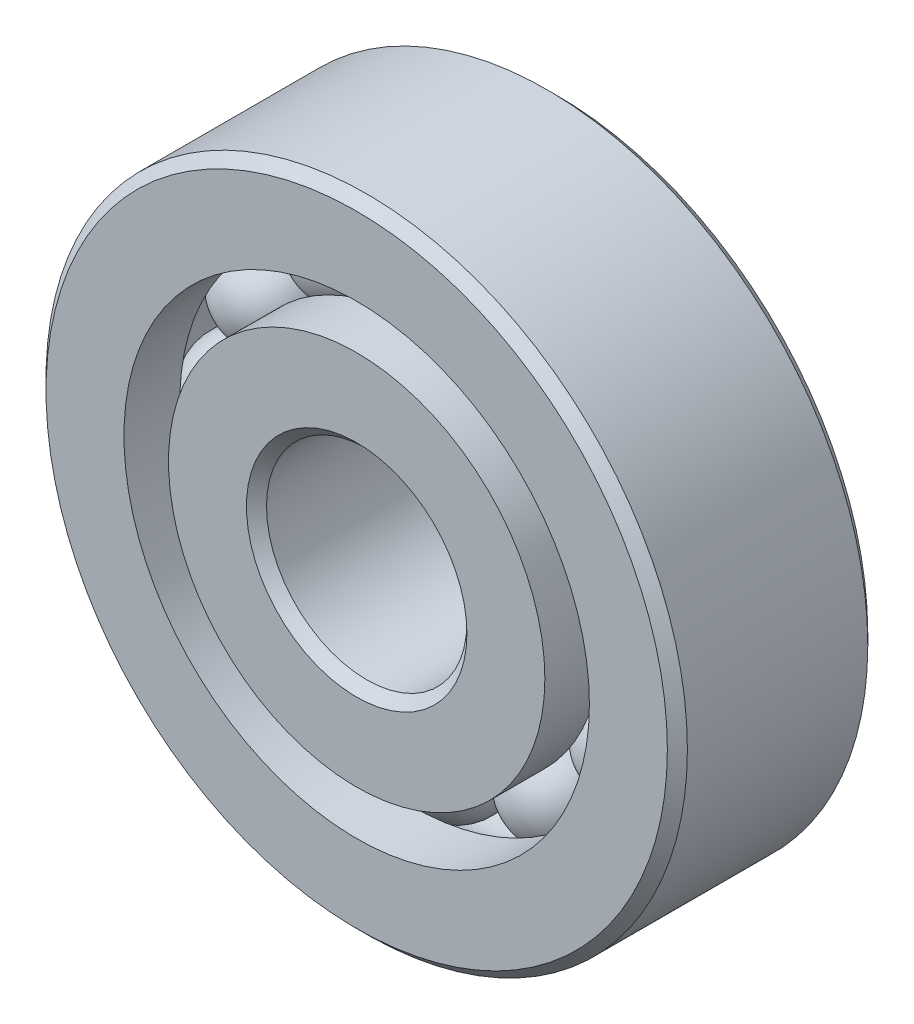
ISO-10303-21;
HEADER;
FILE_DESCRIPTION(('STEP AP214'),'2;1');
FILE_NAME('part.step','',(''),(''),'','','');
FILE_SCHEMA(('AUTOMOTIVE_DESIGN { 1 0 10303 214 1 1 1 1 }'));
ENDSEC;
DATA;
#1=APPLICATION_CONTEXT('core data for automotive mechanical design processes');
#2=APPLICATION_PROTOCOL_DEFINITION('international standard','automotive_design',2000,#1);
#3=PRODUCT_CONTEXT('',#1,'mechanical');
#4=PRODUCT('Part','Part','',(#3));
#5=PRODUCT_RELATED_PRODUCT_CATEGORY('part','',(#4));
#6=PRODUCT_DEFINITION_FORMATION('','',#4);
#7=PRODUCT_DEFINITION_CONTEXT('part definition',#1,'design');
#8=PRODUCT_DEFINITION('design','',#6,#7);
#9=PRODUCT_DEFINITION_SHAPE('','',#8);
#10=(LENGTH_UNIT() NAMED_UNIT(*) SI_UNIT(.MILLI.,.METRE.));
#11=(NAMED_UNIT(*) PLANE_ANGLE_UNIT() SI_UNIT($,.RADIAN.));
#12=(NAMED_UNIT(*) SI_UNIT($,.STERADIAN.) SOLID_ANGLE_UNIT());
#13=UNCERTAINTY_MEASURE_WITH_UNIT(LENGTH_MEASURE(1.E-05),#10,'distance_accuracy_value','');
#14=(GEOMETRIC_REPRESENTATION_CONTEXT(3) GLOBAL_UNCERTAINTY_ASSIGNED_CONTEXT((#13)) GLOBAL_UNIT_ASSIGNED_CONTEXT((#10,
#11,#12)) REPRESENTATION_CONTEXT('',''));
#15=CARTESIAN_POINT('',(0.,0.,0.));
#16=DIRECTION('',(0.,0.,1.));
#17=DIRECTION('',(1.,0.,0.));
#18=AXIS2_PLACEMENT_3D('',#15,#16,#17);
#19=CARTESIAN_POINT('',(-2.62499999999994,4.54663336986834,0.));
#20=DIRECTION('',(0.,0.,1.));
#21=DIRECTION('',(-0.499999999999989,0.866025403784445,0.));
#22=AXIS2_PLACEMENT_3D('',#19,#20,#21);
#23=SPHERICAL_SURFACE('',#22,1.24225998749988);
#24=CARTESIAN_POINT('',(-2.62499999999994,4.54663336986834,1.24225998749988));
#25=VERTEX_POINT('',#24);
#26=VERTEX_LOOP('',#25);
#27=FACE_BOUND('',#26,.T.);
#28=ADVANCED_FACE('F39',(#27),#23,.T.);
#29=CLOSED_SHELL('',(#28));
#30=MANIFOLD_SOLID_BREP('B2',#29);
#31=CARTESIAN_POINT('',(-4.54663336986827,2.62500000000005,0.));
#32=DIRECTION('',(0.,0.,1.));
#33=DIRECTION('',(-0.866025403784433,0.50000000000001,0.));
#34=AXIS2_PLACEMENT_3D('',#31,#32,#33);
#35=SPHERICAL_SURFACE('',#34,1.24225998749988);
#36=CARTESIAN_POINT('',(-4.54663336986827,2.62500000000005,1.24225998749988));
#37=VERTEX_POINT('',#36);
#38=VERTEX_LOOP('',#37);
#39=FACE_BOUND('',#38,.T.);
#40=ADVANCED_FACE('F70',(#39),#35,.T.);
#41=CLOSED_SHELL('',(#40));
#42=MANIFOLD_SOLID_BREP('B6',#41);
#43=CARTESIAN_POINT('',(-5.25,0.,0.));
#44=DIRECTION('',(0.,0.,1.));
#45=DIRECTION('',(-1.,0.,0.));
#46=AXIS2_PLACEMENT_3D('',#43,#44,#45);
#47=SPHERICAL_SURFACE('',#46,1.24225998749988);
#48=CARTESIAN_POINT('',(-5.25,0.,1.24225998749988));
#49=VERTEX_POINT('',#48);
#50=VERTEX_LOOP('',#49);
#51=FACE_BOUND('',#50,.T.);
#52=ADVANCED_FACE('F101',(#51),#47,.T.);
#53=CLOSED_SHELL('',(#52));
#54=MANIFOLD_SOLID_BREP('B35',#53);
#55=CARTESIAN_POINT('',(-4.54663336986833,-2.62499999999996,0.));
#56=DIRECTION('',(0.,0.,1.));
#57=DIRECTION('',(-0.866025403784443,-0.499999999999992,0.));
#58=AXIS2_PLACEMENT_3D('',#55,#56,#57);
#59=SPHERICAL_SURFACE('',#58,1.24225998749988);
#60=CARTESIAN_POINT('',(-4.54663336986833,-2.62499999999996,1.24225998749988));
#61=VERTEX_POINT('',#60);
#62=VERTEX_LOOP('',#61);
#63=FACE_BOUND('',#62,.T.);
#64=ADVANCED_FACE('F132',(#63),#59,.T.);
#65=CLOSED_SHELL('',(#64));
#66=MANIFOLD_SOLID_BREP('B66',#65);
#67=CARTESIAN_POINT('',(-2.62500000000004,-4.54663336986828,0.));
#68=DIRECTION('',(0.,0.,1.));
#69=DIRECTION('',(-0.500000000000007,-0.866025403784435,0.));
#70=AXIS2_PLACEMENT_3D('',#67,#68,#69);
#71=SPHERICAL_SURFACE('',#70,1.24225998749988);
#72=CARTESIAN_POINT('',(-2.62500000000004,-4.54663336986828,1.24225998749988));
#73=VERTEX_POINT('',#72);
#74=VERTEX_LOOP('',#73);
#75=FACE_BOUND('',#74,.T.);
#76=ADVANCED_FACE('F163',(#75),#71,.T.);
#77=CLOSED_SHELL('',(#76));
#78=MANIFOLD_SOLID_BREP('B97',#77);
#79=CARTESIAN_POINT('',(0.,-5.25,0.));
#80=DIRECTION('',(0.,0.,1.));
#81=DIRECTION('',(0.,-1.,0.));
#82=AXIS2_PLACEMENT_3D('',#79,#80,#81);
#83=SPHERICAL_SURFACE('',#82,1.24225998749988);
#84=CARTESIAN_POINT('',(0.,-5.25,1.24225998749988));
#85=VERTEX_POINT('',#84);
#86=VERTEX_LOOP('',#85);
#87=FACE_BOUND('',#86,.T.);
#88=ADVANCED_FACE('F194',(#87),#83,.T.);
#89=CLOSED_SHELL('',(#88));
#90=MANIFOLD_SOLID_BREP('B128',#89);
#91=CARTESIAN_POINT('',(2.62499999999997,-4.54663336986832,0.));
#92=DIRECTION('',(0.,0.,1.));
#93=DIRECTION('',(0.499999999999995,-0.866025403784442,0.));
#94=AXIS2_PLACEMENT_3D('',#91,#92,#93);
#95=SPHERICAL_SURFACE('',#94,1.24225998749988);
#96=CARTESIAN_POINT('',(2.62499999999997,-4.54663336986832,1.24225998749988));
#97=VERTEX_POINT('',#96);
#98=VERTEX_LOOP('',#97);
#99=FACE_BOUND('',#98,.T.);
#100=ADVANCED_FACE('F225',(#99),#95,.T.);
#101=CLOSED_SHELL('',(#100));
#102=MANIFOLD_SOLID_BREP('B159',#101);
#103=CARTESIAN_POINT('',(4.54663336986829,-2.62500000000002,0.));
#104=DIRECTION('',(0.,0.,1.));
#105=DIRECTION('',(0.866025403784436,-0.500000000000004,0.));
#106=AXIS2_PLACEMENT_3D('',#103,#104,#105);
#107=SPHERICAL_SURFACE('',#106,1.24225998749988);
#108=CARTESIAN_POINT('',(4.54663336986829,-2.62500000000002,1.24225998749988));
#109=VERTEX_POINT('',#108);
#110=VERTEX_LOOP('',#109);
#111=FACE_BOUND('',#110,.T.);
#112=ADVANCED_FACE('F258',(#111),#107,.T.);
#113=CLOSED_SHELL('',(#112));
#114=MANIFOLD_SOLID_BREP('B190',#113);
#115=CARTESIAN_POINT('',(5.25,0.,0.));
#116=DIRECTION('',(0.,0.,1.));
#117=DIRECTION('',(1.,0.,0.));
#118=AXIS2_PLACEMENT_3D('',#115,#116,#117);
#119=SPHERICAL_SURFACE('',#118,1.24225998749988);
#120=CARTESIAN_POINT('',(5.25,0.,1.24225998749988));
#121=VERTEX_POINT('',#120);
#122=VERTEX_LOOP('',#121);
#123=FACE_BOUND('',#122,.T.);
#124=ADVANCED_FACE('F291',(#123),#119,.T.);
#125=CLOSED_SHELL('',(#124));
#126=MANIFOLD_SOLID_BREP('B221',#125);
#127=CARTESIAN_POINT('',(4.54663336986831,2.62499999999999,0.));
#128=DIRECTION('',(0.,0.,1.));
#129=DIRECTION('',(0.86602540378444,0.499999999999998,0.));
#130=AXIS2_PLACEMENT_3D('',#127,#128,#129);
#131=SPHERICAL_SURFACE('',#130,1.24225998749988);
#132=CARTESIAN_POINT('',(4.54663336986831,2.62499999999999,1.24225998749988));
#133=VERTEX_POINT('',#132);
#134=VERTEX_LOOP('',#133);
#135=FACE_BOUND('',#134,.T.);
#136=ADVANCED_FACE('F324',(#135),#131,.T.);
#137=CLOSED_SHELL('',(#136));
#138=MANIFOLD_SOLID_BREP('B254',#137);
#139=CARTESIAN_POINT('',(2.62500000000001,4.5466333698683,0.));
#140=DIRECTION('',(0.,0.,1.));
#141=DIRECTION('',(0.500000000000001,0.866025403784438,0.));
#142=AXIS2_PLACEMENT_3D('',#139,#140,#141);
#143=SPHERICAL_SURFACE('',#142,1.24225998749988);
#144=CARTESIAN_POINT('',(2.62500000000001,4.5466333698683,1.24225998749988));
#145=VERTEX_POINT('',#144);
#146=VERTEX_LOOP('',#145);
#147=FACE_BOUND('',#146,.T.);
#148=ADVANCED_FACE('F355',(#147),#143,.T.);
#149=CLOSED_SHELL('',(#148));
#150=MANIFOLD_SOLID_BREP('B287',#149);
#151=CARTESIAN_POINT('',(0.,5.25,0.));
#152=DIRECTION('',(0.,0.,1.));
#153=DIRECTION('',(0.,1.,0.));
#154=AXIS2_PLACEMENT_3D('',#151,#152,#153);
#155=SPHERICAL_SURFACE('',#154,1.24225998749988);
#156=CARTESIAN_POINT('',(0.,5.25,1.24225998749988));
#157=VERTEX_POINT('',#156);
#158=VERTEX_LOOP('',#157);
#159=FACE_BOUND('',#158,.T.);
#160=ADVANCED_FACE('F388',(#159),#155,.T.);
#161=CLOSED_SHELL('',(#160));
#162=MANIFOLD_SOLID_BREP('B320',#161);
#163=CARTESIAN_POINT('',(0.,0.,2.25));
#164=DIRECTION('',(0.,0.,-1.));
#165=DIRECTION('',(-1.,0.,0.));
#166=AXIS2_PLACEMENT_3D('',#163,#164,#165);
#167=CONICAL_SURFACE('',#166,8.,0.785398163397447);
#168=CARTESIAN_POINT('',(0.,0.,2.5));
#169=DIRECTION('',(0.,0.,1.));
#170=DIRECTION('',(1.,0.,0.));
#171=AXIS2_PLACEMENT_3D('',#168,#169,#170);
#172=CIRCLE('',#171,7.75);
#173=CARTESIAN_POINT('',(7.75,0.,2.5));
#174=VERTEX_POINT('',#173);
#175=EDGE_CURVE('E435',#174,#174,#172,.T.);
#176=ORIENTED_EDGE('',*,*,#175,.F.);
#177=EDGE_LOOP('',(#176));
#178=FACE_BOUND('',#177,.T.);
#179=CARTESIAN_POINT('',(0.,0.,2.25));
#180=DIRECTION('',(0.,0.,1.));
#181=DIRECTION('',(1.,0.,0.));
#182=AXIS2_PLACEMENT_3D('',#179,#180,#181);
#183=CIRCLE('',#182,8.);
#184=CARTESIAN_POINT('',(8.,0.,2.25));
#185=VERTEX_POINT('',#184);
#186=EDGE_CURVE('E387',#185,#185,#183,.T.);
#187=ORIENTED_EDGE('',*,*,#186,.T.);
#188=EDGE_LOOP('',(#187));
#189=FACE_BOUND('',#188,.T.);
#190=ADVANCED_FACE('F407',(#178,#189),#167,.T.);
#191=CARTESIAN_POINT('',(0.,0.,2.5));
#192=DIRECTION('',(0.,0.,1.));
#193=DIRECTION('',(1.,0.,0.));
#194=AXIS2_PLACEMENT_3D('',#191,#192,#193);
#195=CYLINDRICAL_SURFACE('',#194,8.);
#196=ORIENTED_EDGE('',*,*,#186,.F.);
#197=EDGE_LOOP('',(#196));
#198=FACE_BOUND('',#197,.T.);
#199=CARTESIAN_POINT('',(0.,0.,-2.25));
#200=DIRECTION('',(0.,0.,1.));
#201=DIRECTION('',(1.,0.,0.));
#202=AXIS2_PLACEMENT_3D('',#199,#200,#201);
#203=CIRCLE('',#202,8.);
#204=CARTESIAN_POINT('',(8.,0.,-2.25));
#205=VERTEX_POINT('',#204);
#206=EDGE_CURVE('E413',#205,#205,#203,.T.);
#207=ORIENTED_EDGE('',*,*,#206,.T.);
#208=EDGE_LOOP('',(#207));
#209=FACE_BOUND('',#208,.T.);
#210=ADVANCED_FACE('F442',(#198,#209),#195,.T.);
#211=CARTESIAN_POINT('',(0.,0.,-2.5));
#212=DIRECTION('',(0.,0.,1.));
#213=DIRECTION('',(1.,0.,0.));
#214=AXIS2_PLACEMENT_3D('',#211,#212,#213);
#215=CONICAL_SURFACE('',#214,7.75,0.785398163397445);
#216=ORIENTED_EDGE('',*,*,#206,.F.);
#217=EDGE_LOOP('',(#216));
#218=FACE_BOUND('',#217,.T.);
#219=CARTESIAN_POINT('',(0.,0.,-2.5));
#220=DIRECTION('',(0.,0.,1.));
#221=DIRECTION('',(1.,0.,0.));
#222=AXIS2_PLACEMENT_3D('',#219,#220,#221);
#223=CIRCLE('',#222,7.75);
#224=CARTESIAN_POINT('',(7.75,0.,-2.5));
#225=VERTEX_POINT('',#224);
#226=EDGE_CURVE('E417',#225,#225,#223,.T.);
#227=ORIENTED_EDGE('',*,*,#226,.T.);
#228=EDGE_LOOP('',(#227));
#229=FACE_BOUND('',#228,.T.);
#230=ADVANCED_FACE('F446',(#218,#229),#215,.T.);
#231=CARTESIAN_POINT('',(0.,7.75,-2.5));
#232=DIRECTION('',(0.,0.,1.));
#233=DIRECTION('',(1.,0.,0.));
#234=AXIS2_PLACEMENT_3D('',#231,#232,#233);
#235=PLANE('',#234);
#236=ORIENTED_EDGE('',*,*,#226,.F.);
#237=EDGE_LOOP('',(#236));
#238=FACE_BOUND('',#237,.T.);
#239=CARTESIAN_POINT('',(0.,0.,-2.5));
#240=DIRECTION('',(0.,0.,1.));
#241=DIRECTION('',(1.,0.,0.));
#242=AXIS2_PLACEMENT_3D('',#239,#240,#241);
#243=CIRCLE('',#242,5.80555555555556);
#244=CARTESIAN_POINT('',(5.80555555555556,0.,-2.5));
#245=VERTEX_POINT('',#244);
#246=EDGE_CURVE('E421',#245,#245,#243,.T.);
#247=ORIENTED_EDGE('',*,*,#246,.T.);
#248=EDGE_LOOP('',(#247));
#249=FACE_BOUND('',#248,.T.);
#250=ADVANCED_FACE('F451',(#238,#249),#235,.F.);
#251=CARTESIAN_POINT('',(0.,0.,2.5));
#252=DIRECTION('',(0.,0.,1.));
#253=DIRECTION('',(1.,0.,0.));
#254=AXIS2_PLACEMENT_3D('',#251,#252,#253);
#255=CYLINDRICAL_SURFACE('',#254,5.80555555555556);
#256=ORIENTED_EDGE('',*,*,#246,.F.);
#257=EDGE_LOOP('',(#256));
#258=FACE_BOUND('',#257,.T.);
#259=CARTESIAN_POINT('',(0.,0.,-1.11111111111111));
#260=DIRECTION('',(0.,0.,1.));
#261=DIRECTION('',(1.,0.,0.));
#262=AXIS2_PLACEMENT_3D('',#259,#260,#261);
#263=CIRCLE('',#262,5.80555555555556);
#264=CARTESIAN_POINT('',(5.80555555555556,0.,-1.11111111111111));
#265=VERTEX_POINT('',#264);
#266=EDGE_CURVE('E426',#265,#265,#263,.T.);
#267=ORIENTED_EDGE('',*,*,#266,.T.);
#268=EDGE_LOOP('',(#267));
#269=FACE_BOUND('',#268,.T.);
#270=ADVANCED_FACE('F457',(#258,#269),#255,.F.);
#271=CARTESIAN_POINT('',(0.,0.,0.));
#272=DIRECTION('',(0.,0.,1.));
#273=DIRECTION('',(1.,0.,0.));
#274=AXIS2_PLACEMENT_3D('',#271,#272,#273);
#275=TOROIDAL_SURFACE('',#274,5.25,1.24225998749988);
#276=ORIENTED_EDGE('',*,*,#266,.F.);
#277=EDGE_LOOP('',(#276));
#278=FACE_BOUND('',#277,.T.);
#279=CARTESIAN_POINT('',(0.,0.,1.11111111111111));
#280=DIRECTION('',(0.,0.,1.));
#281=DIRECTION('',(1.,0.,0.));
#282=AXIS2_PLACEMENT_3D('',#279,#280,#281);
#283=CIRCLE('',#282,5.80555555555556);
#284=CARTESIAN_POINT('',(5.80555555555556,0.,1.11111111111111));
#285=VERTEX_POINT('',#284);
#286=EDGE_CURVE('E429',#285,#285,#283,.T.);
#287=ORIENTED_EDGE('',*,*,#286,.T.);
#288=EDGE_LOOP('',(#287));
#289=FACE_BOUND('',#288,.T.);
#290=ADVANCED_FACE('F461',(#278,#289),#275,.F.);
#291=CARTESIAN_POINT('',(0.,0.,2.5));
#292=DIRECTION('',(0.,0.,1.));
#293=DIRECTION('',(1.,0.,0.));
#294=AXIS2_PLACEMENT_3D('',#291,#292,#293);
#295=CYLINDRICAL_SURFACE('',#294,5.80555555555556);
#296=ORIENTED_EDGE('',*,*,#286,.F.);
#297=EDGE_LOOP('',(#296));
#298=FACE_BOUND('',#297,.T.);
#299=CARTESIAN_POINT('',(0.,0.,2.5));
#300=DIRECTION('',(0.,0.,1.));
#301=DIRECTION('',(1.,0.,0.));
#302=AXIS2_PLACEMENT_3D('',#299,#300,#301);
#303=CIRCLE('',#302,5.80555555555556);
#304=CARTESIAN_POINT('',(5.80555555555556,0.,2.5));
#305=VERTEX_POINT('',#304);
#306=EDGE_CURVE('E432',#305,#305,#303,.T.);
#307=ORIENTED_EDGE('',*,*,#306,.T.);
#308=EDGE_LOOP('',(#307));
#309=FACE_BOUND('',#308,.T.);
#310=ADVANCED_FACE('F465',(#298,#309),#295,.F.);
#311=CARTESIAN_POINT('',(0.,7.75,2.5));
#312=DIRECTION('',(0.,0.,-1.));
#313=DIRECTION('',(-1.,0.,0.));
#314=AXIS2_PLACEMENT_3D('',#311,#312,#313);
#315=PLANE('',#314);
#316=ORIENTED_EDGE('',*,*,#306,.F.);
#317=EDGE_LOOP('',(#316));
#318=FACE_BOUND('',#317,.T.);
#319=ORIENTED_EDGE('',*,*,#175,.T.);
#320=EDGE_LOOP('',(#319));
#321=FACE_BOUND('',#320,.T.);
#322=ADVANCED_FACE('F439',(#318,#321),#315,.F.);
#323=CLOSED_SHELL('',(#190,#210,#230,#250,#270,#290,#310,#322));
#324=MANIFOLD_SOLID_BREP('B351',#323);
#325=CARTESIAN_POINT('',(0.,4.69444444444444,2.5));
#326=DIRECTION('',(0.,0.,-1.));
#327=DIRECTION('',(-1.,0.,0.));
#328=AXIS2_PLACEMENT_3D('',#325,#326,#327);
#329=PLANE('',#328);
#330=CARTESIAN_POINT('',(0.,0.,2.5));
#331=DIRECTION('',(0.,0.,1.));
#332=DIRECTION('',(1.,0.,0.));
#333=AXIS2_PLACEMENT_3D('',#330,#331,#332);
#334=CIRCLE('',#333,2.75);
#335=CARTESIAN_POINT('',(2.75,0.,2.5));
#336=VERTEX_POINT('',#335);
#337=EDGE_CURVE('E406',#336,#336,#334,.T.);
#338=ORIENTED_EDGE('',*,*,#337,.F.);
#339=EDGE_LOOP('',(#338));
#340=FACE_BOUND('',#339,.T.);
#341=CARTESIAN_POINT('',(0.,0.,2.5));
#342=DIRECTION('',(0.,0.,1.));
#343=DIRECTION('',(1.,0.,0.));
#344=AXIS2_PLACEMENT_3D('',#341,#342,#343);
#345=CIRCLE('',#344,4.69444444444444);
#346=CARTESIAN_POINT('',(4.69444444444444,0.,2.5));
#347=VERTEX_POINT('',#346);
#348=EDGE_CURVE('E556',#347,#347,#345,.T.);
#349=ORIENTED_EDGE('',*,*,#348,.T.);
#350=EDGE_LOOP('',(#349));
#351=FACE_BOUND('',#350,.T.);
#352=ADVANCED_FACE('F528',(#340,#351),#329,.F.);
#353=CARTESIAN_POINT('',(0.,0.,2.5));
#354=DIRECTION('',(0.,0.,1.));
#355=DIRECTION('',(1.,0.,0.));
#356=AXIS2_PLACEMENT_3D('',#353,#354,#355);
#357=CONICAL_SURFACE('',#356,2.75,0.785398163397448);
#358=CARTESIAN_POINT('',(0.,0.,2.25));
#359=DIRECTION('',(0.,0.,1.));
#360=DIRECTION('',(1.,0.,0.));
#361=AXIS2_PLACEMENT_3D('',#358,#359,#360);
#362=CIRCLE('',#361,2.5);
#363=CARTESIAN_POINT('',(2.5,0.,2.25));
#364=VERTEX_POINT('',#363);
#365=EDGE_CURVE('E534',#364,#364,#362,.T.);
#366=ORIENTED_EDGE('',*,*,#365,.F.);
#367=EDGE_LOOP('',(#366));
#368=FACE_BOUND('',#367,.T.);
#369=ORIENTED_EDGE('',*,*,#337,.T.);
#370=EDGE_LOOP('',(#369));
#371=FACE_BOUND('',#370,.T.);
#372=ADVANCED_FACE('F593',(#368,#371),#357,.F.);
#373=CARTESIAN_POINT('',(0.,0.,2.5));
#374=DIRECTION('',(0.,0.,1.));
#375=DIRECTION('',(1.,0.,0.));
#376=AXIS2_PLACEMENT_3D('',#373,#374,#375);
#377=CYLINDRICAL_SURFACE('',#376,2.5);
#378=CARTESIAN_POINT('',(0.,0.,-2.25));
#379=DIRECTION('',(0.,0.,1.));
#380=DIRECTION('',(1.,0.,0.));
#381=AXIS2_PLACEMENT_3D('',#378,#379,#380);
#382=CIRCLE('',#381,2.5);
#383=CARTESIAN_POINT('',(2.5,0.,-2.25));
#384=VERTEX_POINT('',#383);
#385=EDGE_CURVE('E538',#384,#384,#382,.T.);
#386=ORIENTED_EDGE('',*,*,#385,.F.);
#387=EDGE_LOOP('',(#386));
#388=FACE_BOUND('',#387,.T.);
#389=ORIENTED_EDGE('',*,*,#365,.T.);
#390=EDGE_LOOP('',(#389));
#391=FACE_BOUND('',#390,.T.);
#392=ADVANCED_FACE('F588',(#388,#391),#377,.F.);
#393=CARTESIAN_POINT('',(0.,0.,-2.25));
#394=DIRECTION('',(0.,0.,-1.));
#395=DIRECTION('',(-1.,0.,0.));
#396=AXIS2_PLACEMENT_3D('',#393,#394,#395);
#397=CONICAL_SURFACE('',#396,2.5,0.785398163397448);
#398=CARTESIAN_POINT('',(0.,0.,-2.5));
#399=DIRECTION('',(0.,0.,1.));
#400=DIRECTION('',(1.,0.,0.));
#401=AXIS2_PLACEMENT_3D('',#398,#399,#400);
#402=CIRCLE('',#401,2.75);
#403=CARTESIAN_POINT('',(2.75,0.,-2.5));
#404=VERTEX_POINT('',#403);
#405=EDGE_CURVE('E542',#404,#404,#402,.T.);
#406=ORIENTED_EDGE('',*,*,#405,.F.);
#407=EDGE_LOOP('',(#406));
#408=FACE_BOUND('',#407,.T.);
#409=ORIENTED_EDGE('',*,*,#385,.T.);
#410=EDGE_LOOP('',(#409));
#411=FACE_BOUND('',#410,.T.);
#412=ADVANCED_FACE('F582',(#408,#411),#397,.F.);
#413=CARTESIAN_POINT('',(0.,4.69444444444444,-2.5));
#414=DIRECTION('',(0.,0.,1.));
#415=DIRECTION('',(1.,0.,0.));
#416=AXIS2_PLACEMENT_3D('',#413,#414,#415);
#417=PLANE('',#416);
#418=CARTESIAN_POINT('',(0.,0.,-2.5));
#419=DIRECTION('',(0.,0.,1.));
#420=DIRECTION('',(1.,0.,0.));
#421=AXIS2_PLACEMENT_3D('',#418,#419,#420);
#422=CIRCLE('',#421,4.69444444444444);
#423=CARTESIAN_POINT('',(4.69444444444444,0.,-2.5));
#424=VERTEX_POINT('',#423);
#425=EDGE_CURVE('E547',#424,#424,#422,.T.);
#426=ORIENTED_EDGE('',*,*,#425,.F.);
#427=EDGE_LOOP('',(#426));
#428=FACE_BOUND('',#427,.T.);
#429=ORIENTED_EDGE('',*,*,#405,.T.);
#430=EDGE_LOOP('',(#429));
#431=FACE_BOUND('',#430,.T.);
#432=ADVANCED_FACE('F576',(#428,#431),#417,.F.);
#433=CARTESIAN_POINT('',(0.,0.,2.5));
#434=DIRECTION('',(0.,0.,1.));
#435=DIRECTION('',(1.,0.,0.));
#436=AXIS2_PLACEMENT_3D('',#433,#434,#435);
#437=CYLINDRICAL_SURFACE('',#436,4.69444444444444);
#438=CARTESIAN_POINT('',(0.,0.,-1.11111111111111));
#439=DIRECTION('',(0.,0.,1.));
#440=DIRECTION('',(1.,0.,0.));
#441=AXIS2_PLACEMENT_3D('',#438,#439,#440);
#442=CIRCLE('',#441,4.69444444444444);
#443=CARTESIAN_POINT('',(4.69444444444444,0.,-1.11111111111111));
#444=VERTEX_POINT('',#443);
#445=EDGE_CURVE('E550',#444,#444,#442,.T.);
#446=ORIENTED_EDGE('',*,*,#445,.F.);
#447=EDGE_LOOP('',(#446));
#448=FACE_BOUND('',#447,.T.);
#449=ORIENTED_EDGE('',*,*,#425,.T.);
#450=EDGE_LOOP('',(#449));
#451=FACE_BOUND('',#450,.T.);
#452=ADVANCED_FACE('F570',(#448,#451),#437,.T.);
#453=CARTESIAN_POINT('',(0.,0.,0.));
#454=DIRECTION('',(0.,0.,1.));
#455=DIRECTION('',(1.,0.,0.));
#456=AXIS2_PLACEMENT_3D('',#453,#454,#455);
#457=TOROIDAL_SURFACE('',#456,5.25,1.24225998749988);
#458=CARTESIAN_POINT('',(0.,0.,1.11111111111111));
#459=DIRECTION('',(0.,0.,1.));
#460=DIRECTION('',(1.,0.,0.));
#461=AXIS2_PLACEMENT_3D('',#458,#459,#460);
#462=CIRCLE('',#461,4.69444444444444);
#463=CARTESIAN_POINT('',(4.69444444444444,0.,1.11111111111111));
#464=VERTEX_POINT('',#463);
#465=EDGE_CURVE('E553',#464,#464,#462,.T.);
#466=ORIENTED_EDGE('',*,*,#465,.F.);
#467=EDGE_LOOP('',(#466));
#468=FACE_BOUND('',#467,.T.);
#469=ORIENTED_EDGE('',*,*,#445,.T.);
#470=EDGE_LOOP('',(#469));
#471=FACE_BOUND('',#470,.T.);
#472=ADVANCED_FACE('F564',(#468,#471),#457,.F.);
#473=CARTESIAN_POINT('',(0.,0.,2.5));
#474=DIRECTION('',(0.,0.,1.));
#475=DIRECTION('',(1.,0.,0.));
#476=AXIS2_PLACEMENT_3D('',#473,#474,#475);
#477=CYLINDRICAL_SURFACE('',#476,4.69444444444444);
#478=ORIENTED_EDGE('',*,*,#348,.F.);
#479=EDGE_LOOP('',(#478));
#480=FACE_BOUND('',#479,.T.);
#481=ORIENTED_EDGE('',*,*,#465,.T.);
#482=EDGE_LOOP('',(#481));
#483=FACE_BOUND('',#482,.T.);
#484=ADVANCED_FACE('F561',(#480,#483),#477,.T.);
#485=CLOSED_SHELL('',(#352,#372,#392,#412,#432,#452,#472,#484));
#486=MANIFOLD_SOLID_BREP('B382',#485);
#487=ADVANCED_BREP_SHAPE_REPRESENTATION('',(#18,#30,#42,#54,#66,#78,#90,#102,#114,#126,#138,
#150,#162,#324,#486),#14);
#488=SHAPE_DEFINITION_REPRESENTATION(#9,#487);
ENDSEC;
END-ISO-10303-21;
